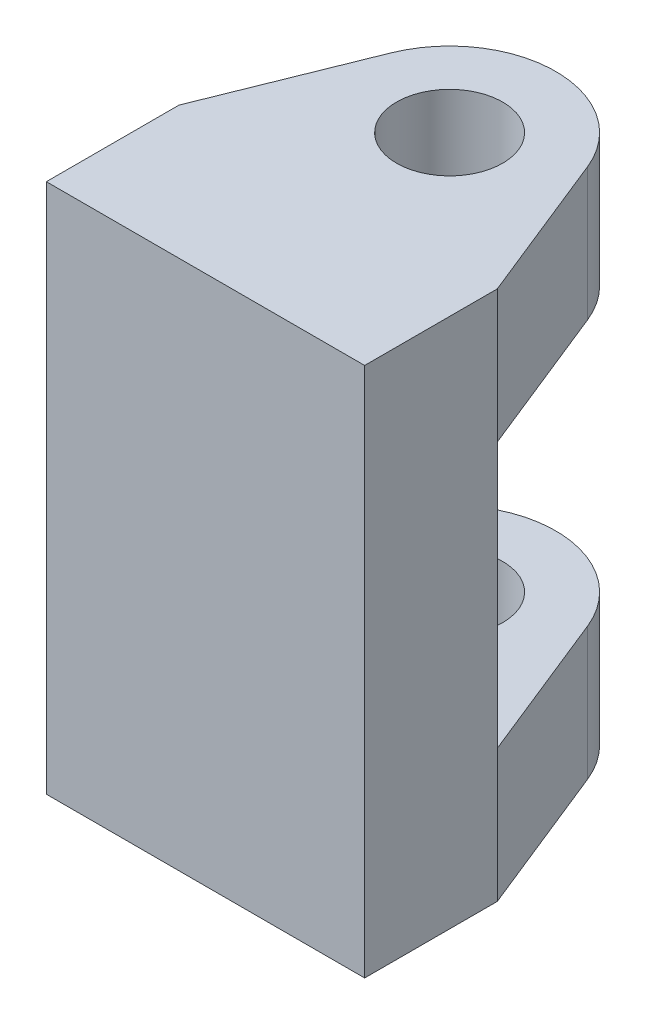
ISO-10303-21;
HEADER;
FILE_DESCRIPTION(('STEP AP214'),'2;1');
FILE_NAME('part.step','',(''),(''),'','','');
FILE_SCHEMA(('AUTOMOTIVE_DESIGN { 1 0 10303 214 1 1 1 1 }'));
ENDSEC;
DATA;
#1=APPLICATION_CONTEXT('core data for automotive mechanical design processes');
#2=APPLICATION_PROTOCOL_DEFINITION('international standard','automotive_design',2000,#1);
#3=PRODUCT_CONTEXT('',#1,'mechanical');
#4=PRODUCT('Part','Part','',(#3));
#5=PRODUCT_RELATED_PRODUCT_CATEGORY('part','',(#4));
#6=PRODUCT_DEFINITION_FORMATION('','',#4);
#7=PRODUCT_DEFINITION_CONTEXT('part definition',#1,'design');
#8=PRODUCT_DEFINITION('design','',#6,#7);
#9=PRODUCT_DEFINITION_SHAPE('','',#8);
#10=(LENGTH_UNIT() NAMED_UNIT(*) SI_UNIT(.MILLI.,.METRE.));
#11=(NAMED_UNIT(*) PLANE_ANGLE_UNIT() SI_UNIT($,.RADIAN.));
#12=(NAMED_UNIT(*) SI_UNIT($,.STERADIAN.) SOLID_ANGLE_UNIT());
#13=UNCERTAINTY_MEASURE_WITH_UNIT(LENGTH_MEASURE(1.E-05),#10,'distance_accuracy_value','');
#14=(GEOMETRIC_REPRESENTATION_CONTEXT(3) GLOBAL_UNCERTAINTY_ASSIGNED_CONTEXT((#13)) GLOBAL_UNIT_ASSIGNED_CONTEXT((#10,
#11,#12)) REPRESENTATION_CONTEXT('',''));
#15=CARTESIAN_POINT('',(0.,0.,0.));
#16=DIRECTION('',(0.,0.,1.));
#17=DIRECTION('',(1.,0.,0.));
#18=AXIS2_PLACEMENT_3D('',#15,#16,#17);
#19=CARTESIAN_POINT('',(0.,0.,0.));
#20=DIRECTION('',(0.,0.,-1.));
#21=DIRECTION('',(-1.,0.,0.));
#22=AXIS2_PLACEMENT_3D('',#19,#20,#21);
#23=PLANE('',#22);
#24=DIRECTION('',(0.,1.,0.));
#25=VECTOR('',#24,1.);
#26=CARTESIAN_POINT('',(6.00000000000001,-9.99999999999999,0.));
#27=LINE('',#26,#25);
#28=CARTESIAN_POINT('',(6.00000000000001,-5.00000000000001,0.));
#29=VERTEX_POINT('',#28);
#30=CARTESIAN_POINT('',(6.00000000000001,5.,0.));
#31=VERTEX_POINT('',#30);
#32=EDGE_CURVE('E55',#29,#31,#27,.T.);
#33=ORIENTED_EDGE('',*,*,#32,.F.);
#34=DIRECTION('',(1.,0.,0.));
#35=VECTOR('',#34,1.);
#36=CARTESIAN_POINT('',(-5.99999999999999,-5.00000000000001,0.));
#37=LINE('',#36,#35);
#38=CARTESIAN_POINT('',(-5.99999999999999,-5.00000000000001,0.));
#39=VERTEX_POINT('',#38);
#40=EDGE_CURVE('E223',#39,#29,#37,.T.);
#41=ORIENTED_EDGE('',*,*,#40,.F.);
#42=DIRECTION('',(0.,-1.,0.));
#43=VECTOR('',#42,1.);
#44=CARTESIAN_POINT('',(-5.99999999999999,-9.99999999999999,0.));
#45=LINE('',#44,#43);
#46=CARTESIAN_POINT('',(-5.99999999999999,5.00000000000001,0.));
#47=VERTEX_POINT('',#46);
#48=EDGE_CURVE('E141',#47,#39,#45,.T.);
#49=ORIENTED_EDGE('',*,*,#48,.F.);
#50=DIRECTION('',(1.,0.,0.));
#51=VECTOR('',#50,1.);
#52=CARTESIAN_POINT('',(-5.99999999999999,5.00000000000001,0.));
#53=LINE('',#52,#51);
#54=EDGE_CURVE('E86',#47,#31,#53,.T.);
#55=ORIENTED_EDGE('',*,*,#54,.T.);
#56=EDGE_LOOP('',(#33,#41,#49,#55));
#57=FACE_BOUND('',#56,.T.);
#58=ADVANCED_FACE('F39',(#57),#23,.T.);
#59=CARTESIAN_POINT('',(6.00000000000001,-9.99999999999999,5.));
#60=DIRECTION('',(-1.,0.,0.));
#61=DIRECTION('',(0.,0.,1.));
#62=AXIS2_PLACEMENT_3D('',#59,#60,#61);
#63=PLANE('',#62);
#64=CARTESIAN_POINT('',(6.00000000000001,-9.99999999999999,0.));
#65=VERTEX_POINT('',#64);
#66=EDGE_CURVE('E76',#65,#29,#27,.T.);
#67=ORIENTED_EDGE('',*,*,#66,.T.);
#68=ORIENTED_EDGE('',*,*,#32,.T.);
#69=DIRECTION('',(0.,1.,0.));
#70=VECTOR('',#69,1.);
#71=CARTESIAN_POINT('',(6.00000000000001,5.00000000000001,0.));
#72=LINE('',#71,#70);
#73=CARTESIAN_POINT('',(6.00000000000001,10.,0.));
#74=VERTEX_POINT('',#73);
#75=EDGE_CURVE('E183',#31,#74,#72,.T.);
#76=ORIENTED_EDGE('',*,*,#75,.T.);
#77=DIRECTION('',(0.,0.,-1.));
#78=VECTOR('',#77,1.);
#79=CARTESIAN_POINT('',(6.00000000000001,10.,5.));
#80=LINE('',#79,#78);
#81=CARTESIAN_POINT('',(6.00000000000001,10.,5.));
#82=VERTEX_POINT('',#81);
#83=EDGE_CURVE('E11',#82,#74,#80,.T.);
#84=ORIENTED_EDGE('',*,*,#83,.F.);
#85=DIRECTION('',(0.,1.,0.));
#86=VECTOR('',#85,1.);
#87=CARTESIAN_POINT('',(6.00000000000001,-9.99999999999999,5.));
#88=LINE('',#87,#86);
#89=CARTESIAN_POINT('',(6.00000000000001,-9.99999999999999,5.));
#90=VERTEX_POINT('',#89);
#91=EDGE_CURVE('E113',#90,#82,#88,.T.);
#92=ORIENTED_EDGE('',*,*,#91,.F.);
#93=DIRECTION('',(0.,0.,-1.));
#94=VECTOR('',#93,1.);
#95=CARTESIAN_POINT('',(6.00000000000001,-9.99999999999999,5.));
#96=LINE('',#95,#94);
#97=EDGE_CURVE('E135',#90,#65,#96,.T.);
#98=ORIENTED_EDGE('',*,*,#97,.T.);
#99=EDGE_LOOP('',(#67,#68,#76,#84,#92,#98));
#100=FACE_BOUND('',#99,.T.);
#101=ADVANCED_FACE('F41',(#100),#63,.F.);
#102=CARTESIAN_POINT('',(-5.99999999999999,10.,5.));
#103=DIRECTION('',(0.,-1.,0.));
#104=DIRECTION('',(0.,0.,-1.));
#105=AXIS2_PLACEMENT_3D('',#102,#103,#104);
#106=PLANE('',#105);
#107=ORIENTED_EDGE('',*,*,#83,.T.);
#108=DIRECTION('',(-0.372897009905257,0.,-0.927872739120898));
#109=VECTOR('',#108,1.);
#110=CARTESIAN_POINT('',(6.00000000000001,10.,0.));
#111=LINE('',#110,#109);
#112=CARTESIAN_POINT('',(3.71149095648359,10.,-5.69445476446708));
#113=VERTEX_POINT('',#112);
#114=EDGE_CURVE('E200',#74,#113,#111,.T.);
#115=ORIENTED_EDGE('',*,*,#114,.T.);
#116=CARTESIAN_POINT('',(0.,10.,-4.20286672484606));
#117=DIRECTION('',(0.,1.,0.));
#118=DIRECTION('',(0.,0.,1.));
#119=AXIS2_PLACEMENT_3D('',#116,#117,#118);
#120=CIRCLE('',#119,4.);
#121=CARTESIAN_POINT('',(-3.7114909564836,10.,-5.69445476446708));
#122=VERTEX_POINT('',#121);
#123=EDGE_CURVE('E177',#113,#122,#120,.T.);
#124=ORIENTED_EDGE('',*,*,#123,.T.);
#125=DIRECTION('',(-0.372897009905255,0.,0.927872739120899));
#126=VECTOR('',#125,1.);
#127=CARTESIAN_POINT('',(-5.99999999999999,10.,0.));
#128=LINE('',#127,#126);
#129=CARTESIAN_POINT('',(-5.99999999999999,10.,0.));
#130=VERTEX_POINT('',#129);
#131=EDGE_CURVE('E124',#122,#130,#128,.T.);
#132=ORIENTED_EDGE('',*,*,#131,.T.);
#133=DIRECTION('',(0.,0.,-1.));
#134=VECTOR('',#133,1.);
#135=CARTESIAN_POINT('',(-5.99999999999999,10.,5.));
#136=LINE('',#135,#134);
#137=CARTESIAN_POINT('',(-5.99999999999999,10.,5.));
#138=VERTEX_POINT('',#137);
#139=EDGE_CURVE('E48',#138,#130,#136,.T.);
#140=ORIENTED_EDGE('',*,*,#139,.F.);
#141=DIRECTION('',(-1.,0.,0.));
#142=VECTOR('',#141,1.);
#143=CARTESIAN_POINT('',(-5.99999999999999,10.,5.));
#144=LINE('',#143,#142);
#145=EDGE_CURVE('E106',#82,#138,#144,.T.);
#146=ORIENTED_EDGE('',*,*,#145,.F.);
#147=EDGE_LOOP('',(#107,#115,#124,#132,#140,#146));
#148=FACE_BOUND('',#147,.T.);
#149=CARTESIAN_POINT('',(0.,10.,-4.20286672484606));
#150=DIRECTION('',(0.,1.,0.));
#151=DIRECTION('',(0.,0.,1.));
#152=AXIS2_PLACEMENT_3D('',#149,#150,#151);
#153=CIRCLE('',#152,2.);
#154=CARTESIAN_POINT('',(0.,10.,-2.20286672484606));
#155=VERTEX_POINT('',#154);
#156=EDGE_CURVE('E255',#155,#155,#153,.T.);
#157=ORIENTED_EDGE('',*,*,#156,.F.);
#158=EDGE_LOOP('',(#157));
#159=FACE_BOUND('',#158,.T.);
#160=ADVANCED_FACE('F120',(#148,#159),#106,.F.);
#161=CARTESIAN_POINT('',(-5.99999999999999,-9.99999999999999,5.));
#162=DIRECTION('',(1.,0.,0.));
#163=DIRECTION('',(0.,0.,-1.));
#164=AXIS2_PLACEMENT_3D('',#161,#162,#163);
#165=PLANE('',#164);
#166=EDGE_CURVE('E142',#130,#47,#45,.T.);
#167=ORIENTED_EDGE('',*,*,#166,.T.);
#168=ORIENTED_EDGE('',*,*,#48,.T.);
#169=DIRECTION('',(0.,-1.,0.));
#170=VECTOR('',#169,1.);
#171=CARTESIAN_POINT('',(-5.99999999999999,-5.00000000000001,0.));
#172=LINE('',#171,#170);
#173=CARTESIAN_POINT('',(-5.99999999999999,-10.,0.));
#174=VERTEX_POINT('',#173);
#175=EDGE_CURVE('E216',#39,#174,#172,.T.);
#176=ORIENTED_EDGE('',*,*,#175,.T.);
#177=DIRECTION('',(0.,0.,-1.));
#178=VECTOR('',#177,1.);
#179=CARTESIAN_POINT('',(-5.99999999999999,-9.99999999999999,5.));
#180=LINE('',#179,#178);
#181=CARTESIAN_POINT('',(-5.99999999999999,-9.99999999999999,5.));
#182=VERTEX_POINT('',#181);
#183=EDGE_CURVE('E128',#182,#174,#180,.T.);
#184=ORIENTED_EDGE('',*,*,#183,.F.);
#185=DIRECTION('',(0.,-1.,0.));
#186=VECTOR('',#185,1.);
#187=CARTESIAN_POINT('',(-5.99999999999999,-9.99999999999999,5.));
#188=LINE('',#187,#186);
#189=EDGE_CURVE('E110',#138,#182,#188,.T.);
#190=ORIENTED_EDGE('',*,*,#189,.F.);
#191=ORIENTED_EDGE('',*,*,#139,.T.);
#192=EDGE_LOOP('',(#167,#168,#176,#184,#190,#191));
#193=FACE_BOUND('',#192,.T.);
#194=ADVANCED_FACE('F129',(#193),#165,.F.);
#195=CARTESIAN_POINT('',(-5.99999999999999,-9.99999999999999,5.));
#196=DIRECTION('',(0.,1.,0.));
#197=DIRECTION('',(0.,0.,1.));
#198=AXIS2_PLACEMENT_3D('',#195,#196,#197);
#199=PLANE('',#198);
#200=ORIENTED_EDGE('',*,*,#183,.T.);
#201=DIRECTION('',(-0.372897009905255,0.,0.927872739120899));
#202=VECTOR('',#201,1.);
#203=CARTESIAN_POINT('',(-5.99999999999999,-10.,0.));
#204=LINE('',#203,#202);
#205=CARTESIAN_POINT('',(-3.7114909564836,-10.,-5.69445476446708));
#206=VERTEX_POINT('',#205);
#207=EDGE_CURVE('E157',#206,#174,#204,.T.);
#208=ORIENTED_EDGE('',*,*,#207,.F.);
#209=CARTESIAN_POINT('',(0.,-10.,-4.20286672484606));
#210=DIRECTION('',(0.,1.,0.));
#211=DIRECTION('',(0.,0.,1.));
#212=AXIS2_PLACEMENT_3D('',#209,#210,#211);
#213=CIRCLE('',#212,4.);
#214=CARTESIAN_POINT('',(3.71149095648359,-10.,-5.69445476446708));
#215=VERTEX_POINT('',#214);
#216=EDGE_CURVE('E234',#215,#206,#213,.T.);
#217=ORIENTED_EDGE('',*,*,#216,.F.);
#218=DIRECTION('',(-0.372897009905257,0.,-0.927872739120898));
#219=VECTOR('',#218,1.);
#220=CARTESIAN_POINT('',(6.00000000000001,-10.,0.));
#221=LINE('',#220,#219);
#222=EDGE_CURVE('E228',#65,#215,#221,.T.);
#223=ORIENTED_EDGE('',*,*,#222,.F.);
#224=ORIENTED_EDGE('',*,*,#97,.F.);
#225=DIRECTION('',(1.,0.,0.));
#226=VECTOR('',#225,1.);
#227=CARTESIAN_POINT('',(-5.99999999999999,-9.99999999999999,5.));
#228=LINE('',#227,#226);
#229=EDGE_CURVE('E64',#182,#90,#228,.T.);
#230=ORIENTED_EDGE('',*,*,#229,.F.);
#231=EDGE_LOOP('',(#200,#208,#217,#223,#224,#230));
#232=FACE_BOUND('',#231,.T.);
#233=CARTESIAN_POINT('',(0.,-10.,-4.20286672484606));
#234=DIRECTION('',(0.,1.,0.));
#235=DIRECTION('',(0.,0.,1.));
#236=AXIS2_PLACEMENT_3D('',#233,#234,#235);
#237=CIRCLE('',#236,2.);
#238=CARTESIAN_POINT('',(0.,-10.,-2.20286672484606));
#239=VERTEX_POINT('',#238);
#240=EDGE_CURVE('E237',#239,#239,#237,.T.);
#241=ORIENTED_EDGE('',*,*,#240,.T.);
#242=EDGE_LOOP('',(#241));
#243=FACE_BOUND('',#242,.T.);
#244=ADVANCED_FACE('F152',(#232,#243),#199,.F.);
#245=CARTESIAN_POINT('',(0.,0.,5.));
#246=DIRECTION('',(0.,0.,-1.));
#247=DIRECTION('',(-1.,0.,0.));
#248=AXIS2_PLACEMENT_3D('',#245,#246,#247);
#249=PLANE('',#248);
#250=ORIENTED_EDGE('',*,*,#91,.T.);
#251=ORIENTED_EDGE('',*,*,#145,.T.);
#252=ORIENTED_EDGE('',*,*,#189,.T.);
#253=ORIENTED_EDGE('',*,*,#229,.T.);
#254=EDGE_LOOP('',(#250,#251,#252,#253));
#255=FACE_BOUND('',#254,.T.);
#256=ADVANCED_FACE('F108',(#255),#249,.F.);
#257=CARTESIAN_POINT('',(-5.99999999999999,5.00000000000001,0.));
#258=DIRECTION('',(-0.927872739120899,0.,-0.372897009905255));
#259=DIRECTION('',(-0.372897009905255,0.,0.927872739120899));
#260=AXIS2_PLACEMENT_3D('',#257,#258,#259);
#261=PLANE('',#260);
#262=ORIENTED_EDGE('',*,*,#131,.F.);
#263=DIRECTION('',(0.,1.,0.));
#264=VECTOR('',#263,1.);
#265=CARTESIAN_POINT('',(-3.7114909564836,5.00000000000001,-5.69445476446708));
#266=LINE('',#265,#264);
#267=CARTESIAN_POINT('',(-3.7114909564836,5.00000000000001,-5.69445476446708));
#268=VERTEX_POINT('',#267);
#269=EDGE_CURVE('E182',#268,#122,#266,.T.);
#270=ORIENTED_EDGE('',*,*,#269,.F.);
#271=DIRECTION('',(-0.372897009905255,0.,0.927872739120899));
#272=VECTOR('',#271,1.);
#273=CARTESIAN_POINT('',(-5.99999999999999,5.00000000000001,0.));
#274=LINE('',#273,#272);
#275=EDGE_CURVE('E188',#268,#47,#274,.T.);
#276=ORIENTED_EDGE('',*,*,#275,.T.);
#277=ORIENTED_EDGE('',*,*,#166,.F.);
#278=EDGE_LOOP('',(#262,#270,#276,#277));
#279=FACE_BOUND('',#278,.T.);
#280=ADVANCED_FACE('F285',(#279),#261,.T.);
#281=CARTESIAN_POINT('',(0.,5.00000000000001,-4.20286672484606));
#282=DIRECTION('',(0.,1.,0.));
#283=DIRECTION('',(0.,0.,1.));
#284=AXIS2_PLACEMENT_3D('',#281,#282,#283);
#285=CYLINDRICAL_SURFACE('',#284,4.);
#286=ORIENTED_EDGE('',*,*,#123,.F.);
#287=DIRECTION('',(0.,1.,0.));
#288=VECTOR('',#287,1.);
#289=CARTESIAN_POINT('',(3.71149095648359,5.00000000000001,-5.69445476446708));
#290=LINE('',#289,#288);
#291=CARTESIAN_POINT('',(3.71149095648359,5.00000000000001,-5.69445476446708));
#292=VERTEX_POINT('',#291);
#293=EDGE_CURVE('E173',#292,#113,#290,.T.);
#294=ORIENTED_EDGE('',*,*,#293,.F.);
#295=CARTESIAN_POINT('',(0.,5.00000000000001,-4.20286672484606));
#296=DIRECTION('',(0.,1.,0.));
#297=DIRECTION('',(0.,0.,1.));
#298=AXIS2_PLACEMENT_3D('',#295,#296,#297);
#299=CIRCLE('',#298,4.);
#300=EDGE_CURVE('E176',#292,#268,#299,.T.);
#301=ORIENTED_EDGE('',*,*,#300,.T.);
#302=ORIENTED_EDGE('',*,*,#269,.T.);
#303=EDGE_LOOP('',(#286,#294,#301,#302));
#304=FACE_BOUND('',#303,.T.);
#305=ADVANCED_FACE('F175',(#304),#285,.T.);
#306=CARTESIAN_POINT('',(6.00000000000001,5.00000000000001,0.));
#307=DIRECTION('',(0.927872739120898,0.,-0.372897009905257));
#308=DIRECTION('',(-0.372897009905257,0.,-0.927872739120898));
#309=AXIS2_PLACEMENT_3D('',#306,#307,#308);
#310=PLANE('',#309);
#311=ORIENTED_EDGE('',*,*,#114,.F.);
#312=ORIENTED_EDGE('',*,*,#75,.F.);
#313=DIRECTION('',(-0.372897009905257,0.,-0.927872739120898));
#314=VECTOR('',#313,1.);
#315=CARTESIAN_POINT('',(6.00000000000001,5.00000000000001,0.));
#316=LINE('',#315,#314);
#317=EDGE_CURVE('E186',#31,#292,#316,.T.);
#318=ORIENTED_EDGE('',*,*,#317,.T.);
#319=ORIENTED_EDGE('',*,*,#293,.T.);
#320=EDGE_LOOP('',(#311,#312,#318,#319));
#321=FACE_BOUND('',#320,.T.);
#322=ADVANCED_FACE('F191',(#321),#310,.T.);
#323=CARTESIAN_POINT('',(0.,5.00000000000001,-4.20286672484606));
#324=DIRECTION('',(0.,1.,0.));
#325=DIRECTION('',(0.,0.,1.));
#326=AXIS2_PLACEMENT_3D('',#323,#324,#325);
#327=PLANE('',#326);
#328=CARTESIAN_POINT('',(0.,5.00000000000001,-4.20286672484606));
#329=DIRECTION('',(0.,1.,0.));
#330=DIRECTION('',(0.,0.,1.));
#331=AXIS2_PLACEMENT_3D('',#328,#329,#330);
#332=CIRCLE('',#331,2.);
#333=CARTESIAN_POINT('',(0.,5.00000000000001,-2.20286672484606));
#334=VERTEX_POINT('',#333);
#335=EDGE_CURVE('E203',#334,#334,#332,.T.);
#336=ORIENTED_EDGE('',*,*,#335,.T.);
#337=EDGE_LOOP('',(#336));
#338=FACE_BOUND('',#337,.T.);
#339=ORIENTED_EDGE('',*,*,#54,.F.);
#340=ORIENTED_EDGE('',*,*,#275,.F.);
#341=ORIENTED_EDGE('',*,*,#300,.F.);
#342=ORIENTED_EDGE('',*,*,#317,.F.);
#343=EDGE_LOOP('',(#339,#340,#341,#342));
#344=FACE_BOUND('',#343,.T.);
#345=ADVANCED_FACE('F185',(#338,#344),#327,.F.);
#346=CARTESIAN_POINT('',(0.,5.00000000000001,-4.20286672484606));
#347=DIRECTION('',(0.,1.,0.));
#348=DIRECTION('',(0.,0.,1.));
#349=AXIS2_PLACEMENT_3D('',#346,#347,#348);
#350=CYLINDRICAL_SURFACE('',#349,2.);
#351=ORIENTED_EDGE('',*,*,#335,.F.);
#352=EDGE_LOOP('',(#351));
#353=FACE_BOUND('',#352,.T.);
#354=ORIENTED_EDGE('',*,*,#156,.T.);
#355=EDGE_LOOP('',(#354));
#356=FACE_BOUND('',#355,.T.);
#357=ADVANCED_FACE('F267',(#353,#356),#350,.F.);
#358=CARTESIAN_POINT('',(0.,-5.00000000000001,-4.20286672484606));
#359=DIRECTION('',(0.,-1.,0.));
#360=DIRECTION('',(0.,0.,1.));
#361=AXIS2_PLACEMENT_3D('',#358,#359,#360);
#362=PLANE('',#361);
#363=ORIENTED_EDGE('',*,*,#40,.T.);
#364=DIRECTION('',(-0.372897009905257,0.,-0.927872739120898));
#365=VECTOR('',#364,1.);
#366=CARTESIAN_POINT('',(6.00000000000001,-5.00000000000001,0.));
#367=LINE('',#366,#365);
#368=CARTESIAN_POINT('',(3.71149095648359,-5.00000000000001,-5.69445476446708));
#369=VERTEX_POINT('',#368);
#370=EDGE_CURVE('E243',#29,#369,#367,.T.);
#371=ORIENTED_EDGE('',*,*,#370,.T.);
#372=CARTESIAN_POINT('',(0.,-5.00000000000001,-4.20286672484606));
#373=DIRECTION('',(0.,1.,0.));
#374=DIRECTION('',(0.,0.,1.));
#375=AXIS2_PLACEMENT_3D('',#372,#373,#374);
#376=CIRCLE('',#375,4.);
#377=CARTESIAN_POINT('',(-3.7114909564836,-5.00000000000001,-5.69445476446708));
#378=VERTEX_POINT('',#377);
#379=EDGE_CURVE('E232',#369,#378,#376,.T.);
#380=ORIENTED_EDGE('',*,*,#379,.T.);
#381=DIRECTION('',(-0.372897009905255,0.,0.927872739120899));
#382=VECTOR('',#381,1.);
#383=CARTESIAN_POINT('',(-5.99999999999999,-5.00000000000001,0.));
#384=LINE('',#383,#382);
#385=EDGE_CURVE('E227',#378,#39,#384,.T.);
#386=ORIENTED_EDGE('',*,*,#385,.T.);
#387=EDGE_LOOP('',(#363,#371,#380,#386));
#388=FACE_BOUND('',#387,.T.);
#389=CARTESIAN_POINT('',(0.,-5.00000000000001,-4.20286672484606));
#390=DIRECTION('',(0.,1.,0.));
#391=DIRECTION('',(0.,0.,1.));
#392=AXIS2_PLACEMENT_3D('',#389,#390,#391);
#393=CIRCLE('',#392,2.);
#394=CARTESIAN_POINT('',(0.,-5.00000000000001,-2.20286672484606));
#395=VERTEX_POINT('',#394);
#396=EDGE_CURVE('E248',#395,#395,#393,.T.);
#397=ORIENTED_EDGE('',*,*,#396,.F.);
#398=EDGE_LOOP('',(#397));
#399=FACE_BOUND('',#398,.T.);
#400=ADVANCED_FACE('F305',(#388,#399),#362,.F.);
#401=CARTESIAN_POINT('',(6.00000000000001,-5.00000000000001,0.));
#402=DIRECTION('',(-0.927872739120898,0.,0.372897009905257));
#403=DIRECTION('',(0.372897009905257,0.,0.927872739120898));
#404=AXIS2_PLACEMENT_3D('',#401,#402,#403);
#405=PLANE('',#404);
#406=ORIENTED_EDGE('',*,*,#222,.T.);
#407=DIRECTION('',(0.,-1.,0.));
#408=VECTOR('',#407,1.);
#409=CARTESIAN_POINT('',(3.71149095648359,-5.00000000000001,-5.69445476446708));
#410=LINE('',#409,#408);
#411=EDGE_CURVE('E251',#369,#215,#410,.T.);
#412=ORIENTED_EDGE('',*,*,#411,.F.);
#413=ORIENTED_EDGE('',*,*,#370,.F.);
#414=ORIENTED_EDGE('',*,*,#66,.F.);
#415=EDGE_LOOP('',(#406,#412,#413,#414));
#416=FACE_BOUND('',#415,.T.);
#417=ADVANCED_FACE('F311',(#416),#405,.F.);
#418=CARTESIAN_POINT('',(0.,-5.00000000000001,-4.20286672484606));
#419=DIRECTION('',(0.,-1.,0.));
#420=DIRECTION('',(0.,0.,-1.));
#421=AXIS2_PLACEMENT_3D('',#418,#419,#420);
#422=CYLINDRICAL_SURFACE('',#421,4.);
#423=ORIENTED_EDGE('',*,*,#216,.T.);
#424=DIRECTION('',(0.,-1.,0.));
#425=VECTOR('',#424,1.);
#426=CARTESIAN_POINT('',(-3.7114909564836,-5.00000000000001,-5.69445476446708));
#427=LINE('',#426,#425);
#428=EDGE_CURVE('E256',#378,#206,#427,.T.);
#429=ORIENTED_EDGE('',*,*,#428,.F.);
#430=ORIENTED_EDGE('',*,*,#379,.F.);
#431=ORIENTED_EDGE('',*,*,#411,.T.);
#432=EDGE_LOOP('',(#423,#429,#430,#431));
#433=FACE_BOUND('',#432,.T.);
#434=ADVANCED_FACE('F318',(#433),#422,.T.);
#435=CARTESIAN_POINT('',(-5.99999999999999,-5.00000000000001,0.));
#436=DIRECTION('',(0.927872739120899,0.,0.372897009905255));
#437=DIRECTION('',(0.372897009905255,0.,-0.927872739120899));
#438=AXIS2_PLACEMENT_3D('',#435,#436,#437);
#439=PLANE('',#438);
#440=ORIENTED_EDGE('',*,*,#207,.T.);
#441=ORIENTED_EDGE('',*,*,#175,.F.);
#442=ORIENTED_EDGE('',*,*,#385,.F.);
#443=ORIENTED_EDGE('',*,*,#428,.T.);
#444=EDGE_LOOP('',(#440,#441,#442,#443));
#445=FACE_BOUND('',#444,.T.);
#446=ADVANCED_FACE('F314',(#445),#439,.F.);
#447=CARTESIAN_POINT('',(0.,-5.00000000000001,-4.20286672484606));
#448=DIRECTION('',(0.,-1.,0.));
#449=DIRECTION('',(0.,0.,-1.));
#450=AXIS2_PLACEMENT_3D('',#447,#448,#449);
#451=CYLINDRICAL_SURFACE('',#450,2.);
#452=ORIENTED_EDGE('',*,*,#396,.T.);
#453=EDGE_LOOP('',(#452));
#454=FACE_BOUND('',#453,.T.);
#455=ORIENTED_EDGE('',*,*,#240,.F.);
#456=EDGE_LOOP('',(#455));
#457=FACE_BOUND('',#456,.T.);
#458=ADVANCED_FACE('F317',(#454,#457),#451,.F.);
#459=CLOSED_SHELL('',(#58,#101,#160,#194,#244,#256,#280,#305,#322,#345,#357,#400,#417,#434,#446,#458));
#460=MANIFOLD_SOLID_BREP('B2',#459);
#461=ADVANCED_BREP_SHAPE_REPRESENTATION('',(#18,#460),#14);
#462=SHAPE_DEFINITION_REPRESENTATION(#9,#461);
ENDSEC;
END-ISO-10303-21;
